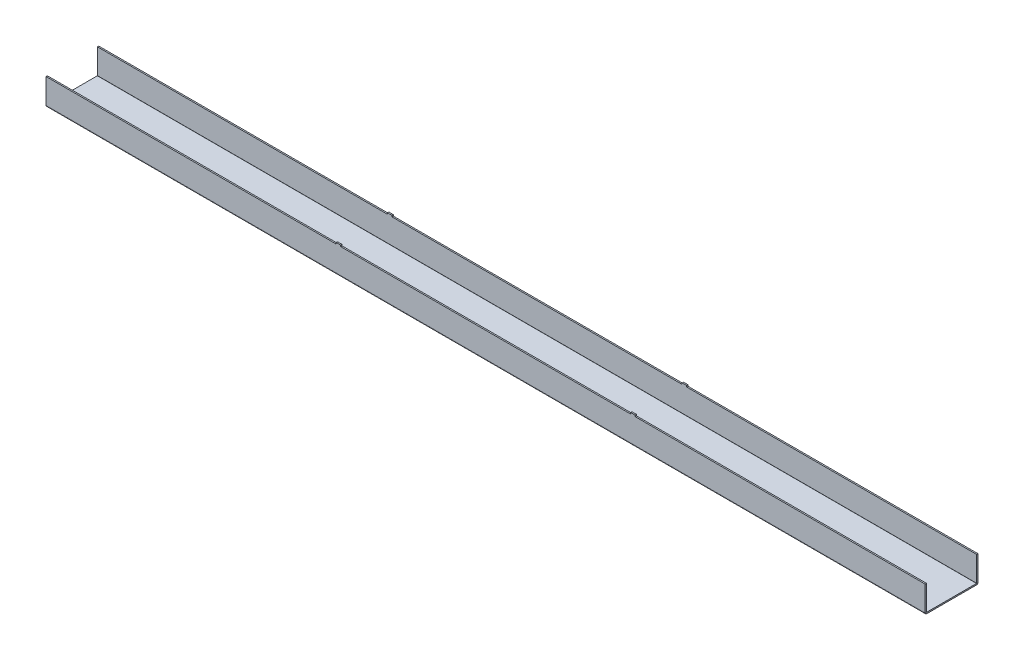
ISO-10303-21;
HEADER;
FILE_DESCRIPTION(('STEP AP214'),'2;1');
FILE_NAME('part.step','',(''),(''),'','','');
FILE_SCHEMA(('AUTOMOTIVE_DESIGN { 1 0 10303 214 1 1 1 1 }'));
ENDSEC;
DATA;
#1=APPLICATION_CONTEXT('core data for automotive mechanical design processes');
#2=APPLICATION_PROTOCOL_DEFINITION('international standard','automotive_design',2000,#1);
#3=PRODUCT_CONTEXT('',#1,'mechanical');
#4=PRODUCT('Part','Part','',(#3));
#5=PRODUCT_RELATED_PRODUCT_CATEGORY('part','',(#4));
#6=PRODUCT_DEFINITION_FORMATION('','',#4);
#7=PRODUCT_DEFINITION_CONTEXT('part definition',#1,'design');
#8=PRODUCT_DEFINITION('design','',#6,#7);
#9=PRODUCT_DEFINITION_SHAPE('','',#8);
#10=(LENGTH_UNIT() NAMED_UNIT(*) SI_UNIT(.MILLI.,.METRE.));
#11=(NAMED_UNIT(*) PLANE_ANGLE_UNIT() SI_UNIT($,.RADIAN.));
#12=(NAMED_UNIT(*) SI_UNIT($,.STERADIAN.) SOLID_ANGLE_UNIT());
#13=UNCERTAINTY_MEASURE_WITH_UNIT(LENGTH_MEASURE(1.E-05),#10,'distance_accuracy_value','');
#14=(GEOMETRIC_REPRESENTATION_CONTEXT(3) GLOBAL_UNCERTAINTY_ASSIGNED_CONTEXT((#13)) GLOBAL_UNIT_ASSIGNED_CONTEXT((#10,
#11,#12)) REPRESENTATION_CONTEXT('',''));
#15=CARTESIAN_POINT('',(0.,0.,0.));
#16=DIRECTION('',(0.,0.,1.));
#17=DIRECTION('',(1.,0.,0.));
#18=AXIS2_PLACEMENT_3D('',#15,#16,#17);
#19=CARTESIAN_POINT('',(-170.,1098.5,-2452.3938102758));
#20=DIRECTION('',(-1.,0.,0.));
#21=DIRECTION('',(0.,1.,0.));
#22=AXIS2_PLACEMENT_3D('',#19,#20,#21);
#23=PLANE('',#22);
#24=DIRECTION('',(0.,-1.,0.));
#25=VECTOR('',#24,1.);
#26=CARTESIAN_POINT('',(-170.,1098.5,-450.));
#27=LINE('',#26,#25);
#28=CARTESIAN_POINT('',(-170.,1100.,-450.));
#29=VERTEX_POINT('',#28);
#30=CARTESIAN_POINT('',(-170.,1098.5,-450.));
#31=VERTEX_POINT('',#30);
#32=EDGE_CURVE('E170',#29,#31,#27,.T.);
#33=ORIENTED_EDGE('',*,*,#32,.F.);
#34=DIRECTION('',(0.,0.,1.));
#35=VECTOR('',#34,1.);
#36=CARTESIAN_POINT('',(-170.,1100.,-2452.3938102758));
#37=LINE('',#36,#35);
#38=CARTESIAN_POINT('',(-170.,1100.,-451.5));
#39=VERTEX_POINT('',#38);
#40=EDGE_CURVE('E854',#39,#29,#37,.T.);
#41=ORIENTED_EDGE('',*,*,#40,.F.);
#42=DIRECTION('',(0.,-1.,0.));
#43=VECTOR('',#42,1.);
#44=CARTESIAN_POINT('',(-170.,1098.5,-451.5));
#45=LINE('',#44,#43);
#46=CARTESIAN_POINT('',(-170.,1098.5,-451.5));
#47=VERTEX_POINT('',#46);
#48=EDGE_CURVE('E503',#39,#47,#45,.T.);
#49=ORIENTED_EDGE('',*,*,#48,.T.);
#50=DIRECTION('',(0.,0.,1.));
#51=VECTOR('',#50,1.);
#52=CARTESIAN_POINT('',(-170.,1098.5,-2452.3938102758));
#53=LINE('',#52,#51);
#54=EDGE_CURVE('E508',#47,#31,#53,.T.);
#55=ORIENTED_EDGE('',*,*,#54,.T.);
#56=EDGE_LOOP('',(#33,#41,#49,#55));
#57=FACE_BOUND('',#56,.T.);
#58=ADVANCED_FACE('F54',(#57),#23,.T.);
#59=CARTESIAN_POINT('',(-165.,1100.,-2452.3938102758));
#60=DIRECTION('',(0.,1.,0.));
#61=DIRECTION('',(0.,0.,1.));
#62=AXIS2_PLACEMENT_3D('',#59,#60,#61);
#63=PLANE('',#62);
#64=DIRECTION('',(-1.,0.,0.));
#65=VECTOR('',#64,1.);
#66=CARTESIAN_POINT('',(-165.,1100.,-450.));
#67=LINE('',#66,#65);
#68=CARTESIAN_POINT('',(-165.,1100.,-450.));
#69=VERTEX_POINT('',#68);
#70=EDGE_CURVE('E160',#69,#29,#67,.T.);
#71=ORIENTED_EDGE('',*,*,#70,.F.);
#72=DIRECTION('',(0.,0.,1.));
#73=VECTOR('',#72,1.);
#74=CARTESIAN_POINT('',(-165.,1100.,-2452.3938102758));
#75=LINE('',#74,#73);
#76=CARTESIAN_POINT('',(-165.,1100.,-451.5));
#77=VERTEX_POINT('',#76);
#78=EDGE_CURVE('E846',#77,#69,#75,.T.);
#79=ORIENTED_EDGE('',*,*,#78,.F.);
#80=DIRECTION('',(-1.,0.,0.));
#81=VECTOR('',#80,1.);
#82=CARTESIAN_POINT('',(-165.,1100.,-451.5));
#83=LINE('',#82,#81);
#84=EDGE_CURVE('E856',#77,#39,#83,.T.);
#85=ORIENTED_EDGE('',*,*,#84,.T.);
#86=ORIENTED_EDGE('',*,*,#40,.T.);
#87=EDGE_LOOP('',(#71,#79,#85,#86));
#88=FACE_BOUND('',#87,.T.);
#89=ADVANCED_FACE('F722',(#88),#63,.T.);
#90=CARTESIAN_POINT('',(-165.,1098.5,-2452.3938102758));
#91=DIRECTION('',(1.,0.,0.));
#92=DIRECTION('',(0.,-1.,0.));
#93=AXIS2_PLACEMENT_3D('',#90,#91,#92);
#94=PLANE('',#93);
#95=DIRECTION('',(0.,1.,0.));
#96=VECTOR('',#95,1.);
#97=CARTESIAN_POINT('',(-165.,1098.5,-450.));
#98=LINE('',#97,#96);
#99=CARTESIAN_POINT('',(-165.,1098.5,-450.));
#100=VERTEX_POINT('',#99);
#101=EDGE_CURVE('E782',#100,#69,#98,.T.);
#102=ORIENTED_EDGE('',*,*,#101,.F.);
#103=DIRECTION('',(0.,0.,1.));
#104=VECTOR('',#103,1.);
#105=CARTESIAN_POINT('',(-165.,1098.5,-2452.3938102758));
#106=LINE('',#105,#104);
#107=CARTESIAN_POINT('',(-165.,1098.5,-451.5));
#108=VERTEX_POINT('',#107);
#109=EDGE_CURVE('E842',#108,#100,#106,.T.);
#110=ORIENTED_EDGE('',*,*,#109,.F.);
#111=DIRECTION('',(0.,1.,0.));
#112=VECTOR('',#111,1.);
#113=CARTESIAN_POINT('',(-165.,1098.5,-451.5));
#114=LINE('',#113,#112);
#115=EDGE_CURVE('E849',#108,#77,#114,.T.);
#116=ORIENTED_EDGE('',*,*,#115,.T.);
#117=ORIENTED_EDGE('',*,*,#78,.T.);
#118=EDGE_LOOP('',(#102,#110,#116,#117));
#119=FACE_BOUND('',#118,.T.);
#120=ADVANCED_FACE('F727',(#119),#94,.T.);
#121=CARTESIAN_POINT('',(500.,1098.5,-2452.3938102758));
#122=DIRECTION('',(0.,-1.,0.));
#123=DIRECTION('',(0.,0.,-1.));
#124=AXIS2_PLACEMENT_3D('',#121,#122,#123);
#125=PLANE('',#124);
#126=ORIENTED_EDGE('',*,*,#109,.T.);
#127=DIRECTION('',(-1.,0.,0.));
#128=VECTOR('',#127,1.);
#129=CARTESIAN_POINT('',(500.,1098.5,-450.));
#130=LINE('',#129,#128);
#131=CARTESIAN_POINT('',(165.,1098.5,-450.));
#132=VERTEX_POINT('',#131);
#133=EDGE_CURVE('E384',#100,#132,#130,.F.);
#134=ORIENTED_EDGE('',*,*,#133,.T.);
#135=DIRECTION('',(0.,0.,1.));
#136=VECTOR('',#135,1.);
#137=CARTESIAN_POINT('',(165.,1098.5,-2452.3938102758));
#138=LINE('',#137,#136);
#139=CARTESIAN_POINT('',(165.,1098.5,-451.5));
#140=VERTEX_POINT('',#139);
#141=EDGE_CURVE('E834',#140,#132,#138,.T.);
#142=ORIENTED_EDGE('',*,*,#141,.F.);
#143=DIRECTION('',(-1.,0.,0.));
#144=VECTOR('',#143,1.);
#145=CARTESIAN_POINT('',(500.,1098.5,-451.5));
#146=LINE('',#145,#144);
#147=EDGE_CURVE('E67',#108,#140,#146,.F.);
#148=ORIENTED_EDGE('',*,*,#147,.F.);
#149=EDGE_LOOP('',(#126,#134,#142,#148));
#150=FACE_BOUND('',#149,.T.);
#151=ADVANCED_FACE('F734',(#150),#125,.F.);
#152=CARTESIAN_POINT('',(165.,1098.5,-2452.3938102758));
#153=DIRECTION('',(-1.,0.,0.));
#154=DIRECTION('',(0.,1.,0.));
#155=AXIS2_PLACEMENT_3D('',#152,#153,#154);
#156=PLANE('',#155);
#157=DIRECTION('',(0.,-1.,0.));
#158=VECTOR('',#157,1.);
#159=CARTESIAN_POINT('',(165.,1098.5,-450.));
#160=LINE('',#159,#158);
#161=CARTESIAN_POINT('',(165.,1100.,-450.));
#162=VERTEX_POINT('',#161);
#163=EDGE_CURVE('E785',#162,#132,#160,.T.);
#164=ORIENTED_EDGE('',*,*,#163,.F.);
#165=DIRECTION('',(0.,0.,1.));
#166=VECTOR('',#165,1.);
#167=CARTESIAN_POINT('',(165.,1100.,-2452.3938102758));
#168=LINE('',#167,#166);
#169=CARTESIAN_POINT('',(165.,1100.,-451.5));
#170=VERTEX_POINT('',#169);
#171=EDGE_CURVE('E800',#170,#162,#168,.T.);
#172=ORIENTED_EDGE('',*,*,#171,.F.);
#173=DIRECTION('',(0.,-1.,0.));
#174=VECTOR('',#173,1.);
#175=CARTESIAN_POINT('',(165.,1098.5,-451.5));
#176=LINE('',#175,#174);
#177=EDGE_CURVE('E837',#170,#140,#176,.T.);
#178=ORIENTED_EDGE('',*,*,#177,.T.);
#179=ORIENTED_EDGE('',*,*,#141,.T.);
#180=EDGE_LOOP('',(#164,#172,#178,#179));
#181=FACE_BOUND('',#180,.T.);
#182=ADVANCED_FACE('F741',(#181),#156,.T.);
#183=CARTESIAN_POINT('',(170.,1100.,-2452.3938102758));
#184=DIRECTION('',(0.,1.,0.));
#185=DIRECTION('',(0.,0.,1.));
#186=AXIS2_PLACEMENT_3D('',#183,#184,#185);
#187=PLANE('',#186);
#188=DIRECTION('',(-1.,0.,0.));
#189=VECTOR('',#188,1.);
#190=CARTESIAN_POINT('',(170.,1100.,-450.));
#191=LINE('',#190,#189);
#192=CARTESIAN_POINT('',(170.,1100.,-450.));
#193=VERTEX_POINT('',#192);
#194=EDGE_CURVE('E400',#193,#162,#191,.T.);
#195=ORIENTED_EDGE('',*,*,#194,.F.);
#196=DIRECTION('',(0.,0.,1.));
#197=VECTOR('',#196,1.);
#198=CARTESIAN_POINT('',(170.,1100.,-2452.3938102758));
#199=LINE('',#198,#197);
#200=CARTESIAN_POINT('',(170.,1100.,-451.5));
#201=VERTEX_POINT('',#200);
#202=EDGE_CURVE('E798',#201,#193,#199,.T.);
#203=ORIENTED_EDGE('',*,*,#202,.F.);
#204=DIRECTION('',(-1.,0.,0.));
#205=VECTOR('',#204,1.);
#206=CARTESIAN_POINT('',(170.,1100.,-451.5));
#207=LINE('',#206,#205);
#208=EDGE_CURVE('E830',#201,#170,#207,.T.);
#209=ORIENTED_EDGE('',*,*,#208,.T.);
#210=ORIENTED_EDGE('',*,*,#171,.T.);
#211=EDGE_LOOP('',(#195,#203,#209,#210));
#212=FACE_BOUND('',#211,.T.);
#213=ADVANCED_FACE('F744',(#212),#187,.T.);
#214=CARTESIAN_POINT('',(170.,1098.5,-2452.3938102758));
#215=DIRECTION('',(1.,0.,0.));
#216=DIRECTION('',(0.,-1.,0.));
#217=AXIS2_PLACEMENT_3D('',#214,#215,#216);
#218=PLANE('',#217);
#219=DIRECTION('',(0.,1.,0.));
#220=VECTOR('',#219,1.);
#221=CARTESIAN_POINT('',(170.,1098.5,-450.));
#222=LINE('',#221,#220);
#223=CARTESIAN_POINT('',(170.,1098.5,-450.));
#224=VERTEX_POINT('',#223);
#225=EDGE_CURVE('E349',#224,#193,#222,.T.);
#226=ORIENTED_EDGE('',*,*,#225,.F.);
#227=DIRECTION('',(0.,0.,1.));
#228=VECTOR('',#227,1.);
#229=CARTESIAN_POINT('',(170.,1098.5,-2452.3938102758));
#230=LINE('',#229,#228);
#231=CARTESIAN_POINT('',(170.,1098.5,-451.5));
#232=VERTEX_POINT('',#231);
#233=EDGE_CURVE('E805',#232,#224,#230,.T.);
#234=ORIENTED_EDGE('',*,*,#233,.F.);
#235=DIRECTION('',(0.,1.,0.));
#236=VECTOR('',#235,1.);
#237=CARTESIAN_POINT('',(170.,1098.5,-451.5));
#238=LINE('',#237,#236);
#239=EDGE_CURVE('E804',#232,#201,#238,.T.);
#240=ORIENTED_EDGE('',*,*,#239,.T.);
#241=ORIENTED_EDGE('',*,*,#202,.T.);
#242=EDGE_LOOP('',(#226,#234,#240,#241));
#243=FACE_BOUND('',#242,.T.);
#244=ADVANCED_FACE('F748',(#243),#218,.T.);
#245=ORIENTED_EDGE('',*,*,#233,.T.);
#246=CARTESIAN_POINT('',(500.,1098.5,-450.));
#247=VERTEX_POINT('',#246);
#248=EDGE_CURVE('E385',#224,#247,#130,.F.);
#249=ORIENTED_EDGE('',*,*,#248,.T.);
#250=DIRECTION('',(0.,0.,1.));
#251=VECTOR('',#250,1.);
#252=CARTESIAN_POINT('',(500.,1098.5,-2452.3938102758));
#253=LINE('',#252,#251);
#254=CARTESIAN_POINT('',(500.,1098.5,-451.5));
#255=VERTEX_POINT('',#254);
#256=EDGE_CURVE('E766',#255,#247,#253,.T.);
#257=ORIENTED_EDGE('',*,*,#256,.F.);
#258=EDGE_CURVE('E12',#232,#255,#146,.F.);
#259=ORIENTED_EDGE('',*,*,#258,.F.);
#260=EDGE_LOOP('',(#245,#249,#257,#259));
#261=FACE_BOUND('',#260,.T.);
#262=ADVANCED_FACE('F739',(#261),#125,.F.);
#263=DIRECTION('',(0.,0.,1.));
#264=VECTOR('',#263,1.);
#265=CARTESIAN_POINT('',(-500.,1098.5,-2452.3938102758));
#266=LINE('',#265,#264);
#267=CARTESIAN_POINT('',(-500.,1098.5,-451.5));
#268=VERTEX_POINT('',#267);
#269=CARTESIAN_POINT('',(-500.,1098.5,-450.));
#270=VERTEX_POINT('',#269);
#271=EDGE_CURVE('E382',#268,#270,#266,.T.);
#272=ORIENTED_EDGE('',*,*,#271,.T.);
#273=EDGE_CURVE('E373',#270,#31,#130,.F.);
#274=ORIENTED_EDGE('',*,*,#273,.T.);
#275=ORIENTED_EDGE('',*,*,#54,.F.);
#276=EDGE_CURVE('E69',#268,#47,#146,.F.);
#277=ORIENTED_EDGE('',*,*,#276,.F.);
#278=EDGE_LOOP('',(#272,#274,#275,#277));
#279=FACE_BOUND('',#278,.T.);
#280=ADVANCED_FACE('F736',(#279),#125,.F.);
#281=CARTESIAN_POINT('',(-500.,1070.7366,-2452.3938102758));
#282=DIRECTION('',(-1.,0.,0.));
#283=DIRECTION('',(0.,1.,0.));
#284=AXIS2_PLACEMENT_3D('',#281,#282,#283);
#285=PLANE('',#284);
#286=DIRECTION('',(0.,1.,0.));
#287=VECTOR('',#286,1.);
#288=CARTESIAN_POINT('',(-500.,1070.7366,-450.));
#289=LINE('',#288,#287);
#290=CARTESIAN_POINT('',(-500.,1070.1,-450.));
#291=VERTEX_POINT('',#290);
#292=EDGE_CURVE('E365',#291,#270,#289,.T.);
#293=ORIENTED_EDGE('',*,*,#292,.T.);
#294=ORIENTED_EDGE('',*,*,#271,.F.);
#295=DIRECTION('',(0.,1.,0.));
#296=VECTOR('',#295,1.);
#297=CARTESIAN_POINT('',(-500.,1070.7366,-451.5));
#298=LINE('',#297,#296);
#299=CARTESIAN_POINT('',(-500.,1070.1,-451.5));
#300=VERTEX_POINT('',#299);
#301=EDGE_CURVE('E367',#268,#300,#298,.F.);
#302=ORIENTED_EDGE('',*,*,#301,.T.);
#303=DIRECTION('',(0.,0.,1.));
#304=VECTOR('',#303,1.);
#305=CARTESIAN_POINT('',(-500.,1070.1,-2452.3938102758));
#306=LINE('',#305,#304);
#307=EDGE_CURVE('E350',#300,#291,#306,.T.);
#308=ORIENTED_EDGE('',*,*,#307,.T.);
#309=EDGE_LOOP('',(#293,#294,#302,#308));
#310=FACE_BOUND('',#309,.T.);
#311=ADVANCED_FACE('F363',(#310),#285,.T.);
#312=CARTESIAN_POINT('',(500.,1068.5,-450.));
#313=DIRECTION('',(0.,0.,-1.));
#314=DIRECTION('',(-1.,0.,0.));
#315=AXIS2_PLACEMENT_3D('',#312,#313,#314);
#316=PLANE('',#315);
#317=ORIENTED_EDGE('',*,*,#292,.F.);
#318=DIRECTION('',(1.,0.,0.));
#319=VECTOR('',#318,1.);
#320=CARTESIAN_POINT('',(-500.,1070.1,-450.));
#321=LINE('',#320,#319);
#322=CARTESIAN_POINT('',(500.,1070.1,-450.));
#323=VERTEX_POINT('',#322);
#324=EDGE_CURVE('E338',#291,#323,#321,.T.);
#325=ORIENTED_EDGE('',*,*,#324,.T.);
#326=DIRECTION('',(0.,1.,0.));
#327=VECTOR('',#326,1.);
#328=CARTESIAN_POINT('',(500.,1070.7366,-450.));
#329=LINE('',#328,#327);
#330=EDGE_CURVE('E764',#247,#323,#329,.F.);
#331=ORIENTED_EDGE('',*,*,#330,.F.);
#332=ORIENTED_EDGE('',*,*,#248,.F.);
#333=ORIENTED_EDGE('',*,*,#225,.T.);
#334=ORIENTED_EDGE('',*,*,#194,.T.);
#335=ORIENTED_EDGE('',*,*,#163,.T.);
#336=ORIENTED_EDGE('',*,*,#133,.F.);
#337=ORIENTED_EDGE('',*,*,#101,.T.);
#338=ORIENTED_EDGE('',*,*,#70,.T.);
#339=ORIENTED_EDGE('',*,*,#32,.T.);
#340=ORIENTED_EDGE('',*,*,#273,.F.);
#341=EDGE_LOOP('',(#317,#325,#331,#332,#333,#334,#335,#336,#337,#338,#339,#340));
#342=FACE_BOUND('',#341,.T.);
#343=ADVANCED_FACE('F372',(#342),#316,.F.);
#344=CARTESIAN_POINT('',(500.,1070.7366,-2452.3938102758));
#345=DIRECTION('',(1.,0.,0.));
#346=DIRECTION('',(0.,-1.,0.));
#347=AXIS2_PLACEMENT_3D('',#344,#345,#346);
#348=PLANE('',#347);
#349=ORIENTED_EDGE('',*,*,#330,.T.);
#350=DIRECTION('',(0.,0.,1.));
#351=VECTOR('',#350,1.);
#352=CARTESIAN_POINT('',(500.,1070.1,-2452.3938102758));
#353=LINE('',#352,#351);
#354=CARTESIAN_POINT('',(500.,1070.1,-451.5));
#355=VERTEX_POINT('',#354);
#356=EDGE_CURVE('E509',#355,#323,#353,.T.);
#357=ORIENTED_EDGE('',*,*,#356,.F.);
#358=DIRECTION('',(0.,1.,0.));
#359=VECTOR('',#358,1.);
#360=CARTESIAN_POINT('',(500.,1070.7366,-451.5));
#361=LINE('',#360,#359);
#362=EDGE_CURVE('E770',#355,#255,#361,.T.);
#363=ORIENTED_EDGE('',*,*,#362,.T.);
#364=ORIENTED_EDGE('',*,*,#256,.T.);
#365=EDGE_LOOP('',(#349,#357,#363,#364));
#366=FACE_BOUND('',#365,.T.);
#367=ADVANCED_FACE('F757',(#366),#348,.T.);
#368=CARTESIAN_POINT('',(500.,1068.5,-451.5));
#369=DIRECTION('',(0.,0.,-1.));
#370=DIRECTION('',(-1.,0.,0.));
#371=AXIS2_PLACEMENT_3D('',#368,#369,#370);
#372=PLANE('',#371);
#373=DIRECTION('',(1.,0.,0.));
#374=VECTOR('',#373,1.);
#375=CARTESIAN_POINT('',(-500.,1070.1,-451.5));
#376=LINE('',#375,#374);
#377=EDGE_CURVE('E59',#300,#355,#376,.T.);
#378=ORIENTED_EDGE('',*,*,#377,.F.);
#379=ORIENTED_EDGE('',*,*,#301,.F.);
#380=ORIENTED_EDGE('',*,*,#276,.T.);
#381=ORIENTED_EDGE('',*,*,#48,.F.);
#382=ORIENTED_EDGE('',*,*,#84,.F.);
#383=ORIENTED_EDGE('',*,*,#115,.F.);
#384=ORIENTED_EDGE('',*,*,#147,.T.);
#385=ORIENTED_EDGE('',*,*,#177,.F.);
#386=ORIENTED_EDGE('',*,*,#208,.F.);
#387=ORIENTED_EDGE('',*,*,#239,.F.);
#388=ORIENTED_EDGE('',*,*,#258,.T.);
#389=ORIENTED_EDGE('',*,*,#362,.F.);
#390=EDGE_LOOP('',(#378,#379,#380,#381,#382,#383,#384,#385,#386,#387,#388,#389));
#391=FACE_BOUND('',#390,.T.);
#392=ADVANCED_FACE('F57',(#391),#372,.T.);
#393=CARTESIAN_POINT('',(170.,1098.5,1492.3938102758));
#394=DIRECTION('',(1.,0.,0.));
#395=DIRECTION('',(0.,0.,1.));
#396=AXIS2_PLACEMENT_3D('',#393,#394,#395);
#397=PLANE('',#396);
#398=DIRECTION('',(0.,-1.,0.));
#399=VECTOR('',#398,1.);
#400=CARTESIAN_POINT('',(170.,1098.5,-510.));
#401=LINE('',#400,#399);
#402=CARTESIAN_POINT('',(170.,1100.,-510.));
#403=VERTEX_POINT('',#402);
#404=CARTESIAN_POINT('',(170.,1098.5,-510.));
#405=VERTEX_POINT('',#404);
#406=EDGE_CURVE('E271',#403,#405,#401,.T.);
#407=ORIENTED_EDGE('',*,*,#406,.F.);
#408=DIRECTION('',(0.,0.,-1.));
#409=VECTOR('',#408,1.);
#410=CARTESIAN_POINT('',(170.,1100.,1492.3938102758));
#411=LINE('',#410,#409);
#412=CARTESIAN_POINT('',(170.,1100.,-508.5));
#413=VERTEX_POINT('',#412);
#414=EDGE_CURVE('E575',#413,#403,#411,.T.);
#415=ORIENTED_EDGE('',*,*,#414,.F.);
#416=DIRECTION('',(0.,-1.,0.));
#417=VECTOR('',#416,1.);
#418=CARTESIAN_POINT('',(170.,1098.5,-508.5));
#419=LINE('',#418,#417);
#420=CARTESIAN_POINT('',(170.,1098.5,-508.5));
#421=VERTEX_POINT('',#420);
#422=EDGE_CURVE('E570',#413,#421,#419,.T.);
#423=ORIENTED_EDGE('',*,*,#422,.T.);
#424=DIRECTION('',(0.,0.,-1.));
#425=VECTOR('',#424,1.);
#426=CARTESIAN_POINT('',(170.,1098.5,1492.3938102758));
#427=LINE('',#426,#425);
#428=EDGE_CURVE('E567',#421,#405,#427,.T.);
#429=ORIENTED_EDGE('',*,*,#428,.T.);
#430=EDGE_LOOP('',(#407,#415,#423,#429));
#431=FACE_BOUND('',#430,.T.);
#432=ADVANCED_FACE('F763',(#431),#397,.T.);
#433=CARTESIAN_POINT('',(165.,1100.,1492.3938102758));
#434=DIRECTION('',(0.,1.,0.));
#435=DIRECTION('',(-1.,0.,0.));
#436=AXIS2_PLACEMENT_3D('',#433,#434,#435);
#437=PLANE('',#436);
#438=DIRECTION('',(1.,0.,0.));
#439=VECTOR('',#438,1.);
#440=CARTESIAN_POINT('',(165.,1100.,-510.));
#441=LINE('',#440,#439);
#442=CARTESIAN_POINT('',(165.,1100.,-510.));
#443=VERTEX_POINT('',#442);
#444=EDGE_CURVE('E263',#443,#403,#441,.T.);
#445=ORIENTED_EDGE('',*,*,#444,.F.);
#446=DIRECTION('',(0.,0.,-1.));
#447=VECTOR('',#446,1.);
#448=CARTESIAN_POINT('',(165.,1100.,1492.3938102758));
#449=LINE('',#448,#447);
#450=CARTESIAN_POINT('',(165.,1100.,-508.5));
#451=VERTEX_POINT('',#450);
#452=EDGE_CURVE('E597',#451,#443,#449,.T.);
#453=ORIENTED_EDGE('',*,*,#452,.F.);
#454=DIRECTION('',(1.,0.,0.));
#455=VECTOR('',#454,1.);
#456=CARTESIAN_POINT('',(165.,1100.,-508.5));
#457=LINE('',#456,#455);
#458=EDGE_CURVE('E569',#451,#413,#457,.T.);
#459=ORIENTED_EDGE('',*,*,#458,.T.);
#460=ORIENTED_EDGE('',*,*,#414,.T.);
#461=EDGE_LOOP('',(#445,#453,#459,#460));
#462=FACE_BOUND('',#461,.T.);
#463=ADVANCED_FACE('F602',(#462),#437,.T.);
#464=CARTESIAN_POINT('',(165.,1098.5,1492.3938102758));
#465=DIRECTION('',(-1.,0.,0.));
#466=DIRECTION('',(0.,0.,-1.));
#467=AXIS2_PLACEMENT_3D('',#464,#465,#466);
#468=PLANE('',#467);
#469=DIRECTION('',(0.,1.,0.));
#470=VECTOR('',#469,1.);
#471=CARTESIAN_POINT('',(165.,1098.5,-510.));
#472=LINE('',#471,#470);
#473=CARTESIAN_POINT('',(165.,1098.5,-510.));
#474=VERTEX_POINT('',#473);
#475=EDGE_CURVE('E475',#474,#443,#472,.T.);
#476=ORIENTED_EDGE('',*,*,#475,.F.);
#477=DIRECTION('',(0.,0.,-1.));
#478=VECTOR('',#477,1.);
#479=CARTESIAN_POINT('',(165.,1098.5,1492.3938102758));
#480=LINE('',#479,#478);
#481=CARTESIAN_POINT('',(165.,1098.5,-508.5));
#482=VERTEX_POINT('',#481);
#483=EDGE_CURVE('E608',#482,#474,#480,.T.);
#484=ORIENTED_EDGE('',*,*,#483,.F.);
#485=DIRECTION('',(0.,1.,0.));
#486=VECTOR('',#485,1.);
#487=CARTESIAN_POINT('',(165.,1098.5,-508.5));
#488=LINE('',#487,#486);
#489=EDGE_CURVE('E592',#482,#451,#488,.T.);
#490=ORIENTED_EDGE('',*,*,#489,.T.);
#491=ORIENTED_EDGE('',*,*,#452,.T.);
#492=EDGE_LOOP('',(#476,#484,#490,#491));
#493=FACE_BOUND('',#492,.T.);
#494=ADVANCED_FACE('F607',(#493),#468,.T.);
#495=CARTESIAN_POINT('',(500.,1098.5,1492.3938102758));
#496=DIRECTION('',(0.,-1.,0.));
#497=DIRECTION('',(1.,0.,0.));
#498=AXIS2_PLACEMENT_3D('',#495,#496,#497);
#499=PLANE('',#498);
#500=ORIENTED_EDGE('',*,*,#483,.T.);
#501=DIRECTION('',(1.,0.,0.));
#502=VECTOR('',#501,1.);
#503=CARTESIAN_POINT('',(500.,1098.5,-510.));
#504=LINE('',#503,#502);
#505=CARTESIAN_POINT('',(-165.,1098.5,-510.));
#506=VERTEX_POINT('',#505);
#507=EDGE_CURVE('E543',#474,#506,#504,.F.);
#508=ORIENTED_EDGE('',*,*,#507,.T.);
#509=DIRECTION('',(0.,0.,-1.));
#510=VECTOR('',#509,1.);
#511=CARTESIAN_POINT('',(-165.,1098.5,1492.3938102758));
#512=LINE('',#511,#510);
#513=CARTESIAN_POINT('',(-165.,1098.5,-508.5));
#514=VERTEX_POINT('',#513);
#515=EDGE_CURVE('E622',#514,#506,#512,.T.);
#516=ORIENTED_EDGE('',*,*,#515,.F.);
#517=DIRECTION('',(1.,0.,0.));
#518=VECTOR('',#517,1.);
#519=CARTESIAN_POINT('',(500.,1098.5,-508.5));
#520=LINE('',#519,#518);
#521=EDGE_CURVE('E519',#482,#514,#520,.F.);
#522=ORIENTED_EDGE('',*,*,#521,.F.);
#523=EDGE_LOOP('',(#500,#508,#516,#522));
#524=FACE_BOUND('',#523,.T.);
#525=ADVANCED_FACE('F611',(#524),#499,.F.);
#526=CARTESIAN_POINT('',(-165.,1098.5,1492.3938102758));
#527=DIRECTION('',(1.,0.,0.));
#528=DIRECTION('',(0.,0.,1.));
#529=AXIS2_PLACEMENT_3D('',#526,#527,#528);
#530=PLANE('',#529);
#531=DIRECTION('',(0.,-1.,0.));
#532=VECTOR('',#531,1.);
#533=CARTESIAN_POINT('',(-165.,1098.5,-510.));
#534=LINE('',#533,#532);
#535=CARTESIAN_POINT('',(-165.,1100.,-510.));
#536=VERTEX_POINT('',#535);
#537=EDGE_CURVE('E470',#536,#506,#534,.T.);
#538=ORIENTED_EDGE('',*,*,#537,.F.);
#539=DIRECTION('',(0.,0.,-1.));
#540=VECTOR('',#539,1.);
#541=CARTESIAN_POINT('',(-165.,1100.,1492.3938102758));
#542=LINE('',#541,#540);
#543=CARTESIAN_POINT('',(-165.,1100.,-508.5));
#544=VERTEX_POINT('',#543);
#545=EDGE_CURVE('E630',#544,#536,#542,.T.);
#546=ORIENTED_EDGE('',*,*,#545,.F.);
#547=DIRECTION('',(0.,-1.,0.));
#548=VECTOR('',#547,1.);
#549=CARTESIAN_POINT('',(-165.,1098.5,-508.5));
#550=LINE('',#549,#548);
#551=EDGE_CURVE('E617',#544,#514,#550,.T.);
#552=ORIENTED_EDGE('',*,*,#551,.T.);
#553=ORIENTED_EDGE('',*,*,#515,.T.);
#554=EDGE_LOOP('',(#538,#546,#552,#553));
#555=FACE_BOUND('',#554,.T.);
#556=ADVANCED_FACE('F964',(#555),#530,.T.);
#557=CARTESIAN_POINT('',(-170.,1100.,1492.3938102758));
#558=DIRECTION('',(0.,1.,0.));
#559=DIRECTION('',(-1.,0.,0.));
#560=AXIS2_PLACEMENT_3D('',#557,#558,#559);
#561=PLANE('',#560);
#562=DIRECTION('',(1.,0.,0.));
#563=VECTOR('',#562,1.);
#564=CARTESIAN_POINT('',(-170.,1100.,-510.));
#565=LINE('',#564,#563);
#566=CARTESIAN_POINT('',(-170.,1100.,-510.));
#567=VERTEX_POINT('',#566);
#568=EDGE_CURVE('E466',#567,#536,#565,.T.);
#569=ORIENTED_EDGE('',*,*,#568,.F.);
#570=DIRECTION('',(0.,0.,-1.));
#571=VECTOR('',#570,1.);
#572=CARTESIAN_POINT('',(-170.,1100.,1492.3938102758));
#573=LINE('',#572,#571);
#574=CARTESIAN_POINT('',(-170.,1100.,-508.5));
#575=VERTEX_POINT('',#574);
#576=EDGE_CURVE('E638',#575,#567,#573,.T.);
#577=ORIENTED_EDGE('',*,*,#576,.F.);
#578=DIRECTION('',(1.,0.,0.));
#579=VECTOR('',#578,1.);
#580=CARTESIAN_POINT('',(-170.,1100.,-508.5));
#581=LINE('',#580,#579);
#582=EDGE_CURVE('E625',#575,#544,#581,.T.);
#583=ORIENTED_EDGE('',*,*,#582,.T.);
#584=ORIENTED_EDGE('',*,*,#545,.T.);
#585=EDGE_LOOP('',(#569,#577,#583,#584));
#586=FACE_BOUND('',#585,.T.);
#587=ADVANCED_FACE('F973',(#586),#561,.T.);
#588=CARTESIAN_POINT('',(-170.,1098.5,1492.3938102758));
#589=DIRECTION('',(-1.,0.,0.));
#590=DIRECTION('',(0.,0.,-1.));
#591=AXIS2_PLACEMENT_3D('',#588,#589,#590);
#592=PLANE('',#591);
#593=DIRECTION('',(0.,1.,0.));
#594=VECTOR('',#593,1.);
#595=CARTESIAN_POINT('',(-170.,1098.5,-510.));
#596=LINE('',#595,#594);
#597=CARTESIAN_POINT('',(-170.,1098.5,-510.));
#598=VERTEX_POINT('',#597);
#599=EDGE_CURVE('E440',#598,#567,#596,.T.);
#600=ORIENTED_EDGE('',*,*,#599,.F.);
#601=DIRECTION('',(0.,0.,-1.));
#602=VECTOR('',#601,1.);
#603=CARTESIAN_POINT('',(-170.,1098.5,1492.3938102758));
#604=LINE('',#603,#602);
#605=CARTESIAN_POINT('',(-170.,1098.5,-508.5));
#606=VERTEX_POINT('',#605);
#607=EDGE_CURVE('E538',#606,#598,#604,.T.);
#608=ORIENTED_EDGE('',*,*,#607,.F.);
#609=DIRECTION('',(0.,1.,0.));
#610=VECTOR('',#609,1.);
#611=CARTESIAN_POINT('',(-170.,1098.5,-508.5));
#612=LINE('',#611,#610);
#613=EDGE_CURVE('E633',#606,#575,#612,.T.);
#614=ORIENTED_EDGE('',*,*,#613,.T.);
#615=ORIENTED_EDGE('',*,*,#576,.T.);
#616=EDGE_LOOP('',(#600,#608,#614,#615));
#617=FACE_BOUND('',#616,.T.);
#618=ADVANCED_FACE('F983',(#617),#592,.T.);
#619=ORIENTED_EDGE('',*,*,#607,.T.);
#620=CARTESIAN_POINT('',(-500.,1098.5,-510.));
#621=VERTEX_POINT('',#620);
#622=EDGE_CURVE('E455',#598,#621,#504,.F.);
#623=ORIENTED_EDGE('',*,*,#622,.T.);
#624=DIRECTION('',(0.,0.,-1.));
#625=VECTOR('',#624,1.);
#626=CARTESIAN_POINT('',(-500.,1098.5,1492.3938102758));
#627=LINE('',#626,#625);
#628=CARTESIAN_POINT('',(-500.,1098.5,-508.500000000001));
#629=VERTEX_POINT('',#628);
#630=EDGE_CURVE('E492',#629,#621,#627,.T.);
#631=ORIENTED_EDGE('',*,*,#630,.F.);
#632=EDGE_CURVE('E181',#606,#629,#520,.F.);
#633=ORIENTED_EDGE('',*,*,#632,.F.);
#634=EDGE_LOOP('',(#619,#623,#631,#633));
#635=FACE_BOUND('',#634,.T.);
#636=ADVANCED_FACE('F536',(#635),#499,.F.);
#637=DIRECTION('',(0.,0.,-1.));
#638=VECTOR('',#637,1.);
#639=CARTESIAN_POINT('',(500.,1098.5,1492.3938102758));
#640=LINE('',#639,#638);
#641=CARTESIAN_POINT('',(500.,1098.5,-508.5));
#642=VERTEX_POINT('',#641);
#643=CARTESIAN_POINT('',(500.,1098.5,-510.));
#644=VERTEX_POINT('',#643);
#645=EDGE_CURVE('E542',#642,#644,#640,.T.);
#646=ORIENTED_EDGE('',*,*,#645,.T.);
#647=EDGE_CURVE('E454',#644,#405,#504,.F.);
#648=ORIENTED_EDGE('',*,*,#647,.T.);
#649=ORIENTED_EDGE('',*,*,#428,.F.);
#650=EDGE_CURVE('E520',#642,#421,#520,.F.);
#651=ORIENTED_EDGE('',*,*,#650,.F.);
#652=EDGE_LOOP('',(#646,#648,#649,#651));
#653=FACE_BOUND('',#652,.T.);
#654=ADVANCED_FACE('F566',(#653),#499,.F.);
#655=CARTESIAN_POINT('',(500.,1070.7366,1492.3938102758));
#656=DIRECTION('',(1.,0.,0.));
#657=DIRECTION('',(0.,0.,1.));
#658=AXIS2_PLACEMENT_3D('',#655,#656,#657);
#659=PLANE('',#658);
#660=DIRECTION('',(0.,1.,0.));
#661=VECTOR('',#660,1.);
#662=CARTESIAN_POINT('',(500.,1070.7366,-510.));
#663=LINE('',#662,#661);
#664=CARTESIAN_POINT('',(500.000000000001,1070.1,-510.));
#665=VERTEX_POINT('',#664);
#666=EDGE_CURVE('E450',#665,#644,#663,.T.);
#667=ORIENTED_EDGE('',*,*,#666,.T.);
#668=ORIENTED_EDGE('',*,*,#645,.F.);
#669=DIRECTION('',(0.,1.,0.));
#670=VECTOR('',#669,1.);
#671=CARTESIAN_POINT('',(500.,1070.7366,-508.5));
#672=LINE('',#671,#670);
#673=CARTESIAN_POINT('',(500.000000000001,1070.1,-508.5));
#674=VERTEX_POINT('',#673);
#675=EDGE_CURVE('E447',#642,#674,#672,.F.);
#676=ORIENTED_EDGE('',*,*,#675,.T.);
#677=DIRECTION('',(0.,0.,-1.));
#678=VECTOR('',#677,1.);
#679=CARTESIAN_POINT('',(500.,1070.1,1492.3938102758));
#680=LINE('',#679,#678);
#681=EDGE_CURVE('E441',#674,#665,#680,.T.);
#682=ORIENTED_EDGE('',*,*,#681,.T.);
#683=EDGE_LOOP('',(#667,#668,#676,#682));
#684=FACE_BOUND('',#683,.T.);
#685=ADVANCED_FACE('F558',(#684),#659,.T.);
#686=CARTESIAN_POINT('',(500.,1098.5,-510.));
#687=DIRECTION('',(0.,0.,1.));
#688=DIRECTION('',(1.,0.,0.));
#689=AXIS2_PLACEMENT_3D('',#686,#687,#688);
#690=PLANE('',#689);
#691=ORIENTED_EDGE('',*,*,#666,.F.);
#692=DIRECTION('',(-1.,0.,0.));
#693=VECTOR('',#692,1.);
#694=CARTESIAN_POINT('',(500.,1070.1,-510.));
#695=LINE('',#694,#693);
#696=CARTESIAN_POINT('',(-499.999999999999,1070.1,-510.));
#697=VERTEX_POINT('',#696);
#698=EDGE_CURVE('E434',#665,#697,#695,.T.);
#699=ORIENTED_EDGE('',*,*,#698,.T.);
#700=DIRECTION('',(0.,1.,0.));
#701=VECTOR('',#700,1.);
#702=CARTESIAN_POINT('',(-500.,1070.7366,-510.));
#703=LINE('',#702,#701);
#704=EDGE_CURVE('E485',#621,#697,#703,.F.);
#705=ORIENTED_EDGE('',*,*,#704,.F.);
#706=ORIENTED_EDGE('',*,*,#622,.F.);
#707=ORIENTED_EDGE('',*,*,#599,.T.);
#708=ORIENTED_EDGE('',*,*,#568,.T.);
#709=ORIENTED_EDGE('',*,*,#537,.T.);
#710=ORIENTED_EDGE('',*,*,#507,.F.);
#711=ORIENTED_EDGE('',*,*,#475,.T.);
#712=ORIENTED_EDGE('',*,*,#444,.T.);
#713=ORIENTED_EDGE('',*,*,#406,.T.);
#714=ORIENTED_EDGE('',*,*,#647,.F.);
#715=EDGE_LOOP('',(#691,#699,#705,#706,#707,#708,#709,#710,#711,#712,#713,#714));
#716=FACE_BOUND('',#715,.T.);
#717=ADVANCED_FACE('F546',(#716),#690,.F.);
#718=CARTESIAN_POINT('',(-500.,1070.7366,1492.3938102758));
#719=DIRECTION('',(-1.,0.,0.));
#720=DIRECTION('',(0.,0.,-1.));
#721=AXIS2_PLACEMENT_3D('',#718,#719,#720);
#722=PLANE('',#721);
#723=ORIENTED_EDGE('',*,*,#704,.T.);
#724=DIRECTION('',(0.,0.,-1.));
#725=VECTOR('',#724,1.);
#726=CARTESIAN_POINT('',(-499.999999999999,1070.1,1492.3938102758));
#727=LINE('',#726,#725);
#728=CARTESIAN_POINT('',(-499.999999999998,1070.1,-508.5));
#729=VERTEX_POINT('',#728);
#730=EDGE_CURVE('E577',#729,#697,#727,.T.);
#731=ORIENTED_EDGE('',*,*,#730,.F.);
#732=DIRECTION('',(0.,1.,0.));
#733=VECTOR('',#732,1.);
#734=CARTESIAN_POINT('',(-500.,1070.7366,-508.5));
#735=LINE('',#734,#733);
#736=EDGE_CURVE('E488',#729,#629,#735,.T.);
#737=ORIENTED_EDGE('',*,*,#736,.T.);
#738=ORIENTED_EDGE('',*,*,#630,.T.);
#739=EDGE_LOOP('',(#723,#731,#737,#738));
#740=FACE_BOUND('',#739,.T.);
#741=ADVANCED_FACE('F530',(#740),#722,.T.);
#742=CARTESIAN_POINT('',(500.,1098.5,-508.5));
#743=DIRECTION('',(0.,0.,1.));
#744=DIRECTION('',(1.,0.,0.));
#745=AXIS2_PLACEMENT_3D('',#742,#743,#744);
#746=PLANE('',#745);
#747=DIRECTION('',(-1.,0.,0.));
#748=VECTOR('',#747,1.);
#749=CARTESIAN_POINT('',(500.,1070.1,-508.5));
#750=LINE('',#749,#748);
#751=EDGE_CURVE('E563',#674,#729,#750,.T.);
#752=ORIENTED_EDGE('',*,*,#751,.F.);
#753=ORIENTED_EDGE('',*,*,#675,.F.);
#754=ORIENTED_EDGE('',*,*,#650,.T.);
#755=ORIENTED_EDGE('',*,*,#422,.F.);
#756=ORIENTED_EDGE('',*,*,#458,.F.);
#757=ORIENTED_EDGE('',*,*,#489,.F.);
#758=ORIENTED_EDGE('',*,*,#521,.T.);
#759=ORIENTED_EDGE('',*,*,#551,.F.);
#760=ORIENTED_EDGE('',*,*,#582,.F.);
#761=ORIENTED_EDGE('',*,*,#613,.F.);
#762=ORIENTED_EDGE('',*,*,#632,.T.);
#763=ORIENTED_EDGE('',*,*,#736,.F.);
#764=EDGE_LOOP('',(#752,#753,#754,#755,#756,#757,#758,#759,#760,#761,#762,#763));
#765=FACE_BOUND('',#764,.T.);
#766=ADVANCED_FACE('F562',(#765),#746,.T.);
#767=CARTESIAN_POINT('',(500.,1068.5,-510.));
#768=DIRECTION('',(0.,1.,0.));
#769=DIRECTION('',(0.,0.,1.));
#770=AXIS2_PLACEMENT_3D('',#767,#768,#769);
#771=PLANE('',#770);
#772=DIRECTION('',(-1.,0.,0.));
#773=VECTOR('',#772,1.);
#774=CARTESIAN_POINT('',(500.,1068.5,-508.4));
#775=LINE('',#774,#773);
#776=CARTESIAN_POINT('',(500.000000000001,1068.5,-508.4));
#777=VERTEX_POINT('',#776);
#778=CARTESIAN_POINT('',(-500.,1068.5,-508.4));
#779=VERTEX_POINT('',#778);
#780=EDGE_CURVE('E281',#777,#779,#775,.T.);
#781=ORIENTED_EDGE('',*,*,#780,.F.);
#782=DIRECTION('',(0.,0.,-1.));
#783=VECTOR('',#782,1.);
#784=CARTESIAN_POINT('',(500.,1068.5,-451.5));
#785=LINE('',#784,#783);
#786=CARTESIAN_POINT('',(500.,1068.5,-451.6));
#787=VERTEX_POINT('',#786);
#788=EDGE_CURVE('E428',#787,#777,#785,.T.);
#789=ORIENTED_EDGE('',*,*,#788,.F.);
#790=DIRECTION('',(1.,0.,0.));
#791=VECTOR('',#790,1.);
#792=CARTESIAN_POINT('',(-500.,1068.5,-451.6));
#793=LINE('',#792,#791);
#794=CARTESIAN_POINT('',(-500.,1068.5,-451.6));
#795=VERTEX_POINT('',#794);
#796=EDGE_CURVE('E290',#795,#787,#793,.T.);
#797=ORIENTED_EDGE('',*,*,#796,.F.);
#798=DIRECTION('',(0.,0.,1.));
#799=VECTOR('',#798,1.);
#800=CARTESIAN_POINT('',(-500.,1068.5,-508.5));
#801=LINE('',#800,#799);
#802=EDGE_CURVE('E660',#779,#795,#801,.T.);
#803=ORIENTED_EDGE('',*,*,#802,.F.);
#804=EDGE_LOOP('',(#781,#789,#797,#803));
#805=FACE_BOUND('',#804,.T.);
#806=ADVANCED_FACE('F709',(#805),#771,.F.);
#807=CARTESIAN_POINT('',(500.,3073.22364203301,-510.));
#808=DIRECTION('',(-1.,0.,0.));
#809=DIRECTION('',(0.,0.,1.));
#810=AXIS2_PLACEMENT_3D('',#807,#808,#809);
#811=PLANE('',#810);
#812=DIRECTION('',(0.,-1.,0.));
#813=VECTOR('',#812,1.);
#814=CARTESIAN_POINT('',(500.,3073.22364203301,-451.6));
#815=LINE('',#814,#813);
#816=CARTESIAN_POINT('',(500.,1070.,-451.6));
#817=VERTEX_POINT('',#816);
#818=EDGE_CURVE('E679',#817,#787,#815,.T.);
#819=ORIENTED_EDGE('',*,*,#818,.T.);
#820=ORIENTED_EDGE('',*,*,#788,.T.);
#821=DIRECTION('',(0.,-1.,0.));
#822=VECTOR('',#821,1.);
#823=CARTESIAN_POINT('',(500.,3073.22364203301,-508.4));
#824=LINE('',#823,#822);
#825=CARTESIAN_POINT('',(500.000000000001,1070.,-508.4));
#826=VERTEX_POINT('',#825);
#827=EDGE_CURVE('E555',#826,#777,#824,.T.);
#828=ORIENTED_EDGE('',*,*,#827,.F.);
#829=DIRECTION('',(0.,0.,1.));
#830=VECTOR('',#829,1.);
#831=CARTESIAN_POINT('',(500.,1070.,-510.));
#832=LINE('',#831,#830);
#833=EDGE_CURVE('E663',#817,#826,#832,.F.);
#834=ORIENTED_EDGE('',*,*,#833,.F.);
#835=EDGE_LOOP('',(#819,#820,#828,#834));
#836=FACE_BOUND('',#835,.T.);
#837=ADVANCED_FACE('F706',(#836),#811,.F.);
#838=CARTESIAN_POINT('',(-500.,3073.22364203301,-510.));
#839=DIRECTION('',(1.,0.,0.));
#840=DIRECTION('',(0.,0.,-1.));
#841=AXIS2_PLACEMENT_3D('',#838,#839,#840);
#842=PLANE('',#841);
#843=DIRECTION('',(0.,-1.,0.));
#844=VECTOR('',#843,1.);
#845=CARTESIAN_POINT('',(-500.,3073.22364203301,-508.4));
#846=LINE('',#845,#844);
#847=CARTESIAN_POINT('',(-499.999999999999,1070.,-508.4));
#848=VERTEX_POINT('',#847);
#849=EDGE_CURVE('E684',#848,#779,#846,.T.);
#850=ORIENTED_EDGE('',*,*,#849,.T.);
#851=ORIENTED_EDGE('',*,*,#802,.T.);
#852=DIRECTION('',(0.,-1.,0.));
#853=VECTOR('',#852,1.);
#854=CARTESIAN_POINT('',(-500.,3073.22364203301,-451.6));
#855=LINE('',#854,#853);
#856=CARTESIAN_POINT('',(-500.,1070.,-451.6));
#857=VERTEX_POINT('',#856);
#858=EDGE_CURVE('E357',#857,#795,#855,.T.);
#859=ORIENTED_EDGE('',*,*,#858,.F.);
#860=DIRECTION('',(0.,0.,1.));
#861=VECTOR('',#860,1.);
#862=CARTESIAN_POINT('',(-500.,1070.,-510.));
#863=LINE('',#862,#861);
#864=EDGE_CURVE('E672',#848,#857,#863,.T.);
#865=ORIENTED_EDGE('',*,*,#864,.F.);
#866=EDGE_LOOP('',(#850,#851,#859,#865));
#867=FACE_BOUND('',#866,.T.);
#868=ADVANCED_FACE('F700',(#867),#842,.F.);
#869=CARTESIAN_POINT('',(500.,1070.,-510.));
#870=DIRECTION('',(0.,1.,0.));
#871=DIRECTION('',(0.,0.,1.));
#872=AXIS2_PLACEMENT_3D('',#869,#870,#871);
#873=PLANE('',#872);
#874=ORIENTED_EDGE('',*,*,#833,.T.);
#875=DIRECTION('',(-1.,0.,0.));
#876=VECTOR('',#875,1.);
#877=CARTESIAN_POINT('',(500.,1070.,-508.4));
#878=LINE('',#877,#876);
#879=EDGE_CURVE('E668',#826,#848,#878,.T.);
#880=ORIENTED_EDGE('',*,*,#879,.T.);
#881=ORIENTED_EDGE('',*,*,#864,.T.);
#882=DIRECTION('',(1.,0.,0.));
#883=VECTOR('',#882,1.);
#884=CARTESIAN_POINT('',(-500.,1070.,-451.6));
#885=LINE('',#884,#883);
#886=EDGE_CURVE('E676',#857,#817,#885,.T.);
#887=ORIENTED_EDGE('',*,*,#886,.T.);
#888=EDGE_LOOP('',(#874,#880,#881,#887));
#889=FACE_BOUND('',#888,.T.);
#890=ADVANCED_FACE('F702',(#889),#873,.T.);
#891=CARTESIAN_POINT('',(-500.,1070.1,-508.4));
#892=DIRECTION('',(-1.,0.,-1.58603289232132E-12));
#893=DIRECTION('',(-1.58603289232132E-12,0.,1.));
#894=AXIS2_PLACEMENT_3D('',#891,#892,#893);
#895=PLANE('',#894);
#896=ORIENTED_EDGE('',*,*,#849,.F.);
#897=CARTESIAN_POINT('',(-499.999999999999,1070.1,-508.4));
#898=DIRECTION('',(-1.,0.,0.));
#899=DIRECTION('',(0.,-1.,0.));
#900=AXIS2_PLACEMENT_3D('',#897,#898,#899);
#901=CIRCLE('',#900,0.099999999999995);
#902=EDGE_CURVE('E418',#848,#729,#901,.F.);
#903=ORIENTED_EDGE('',*,*,#902,.T.);
#904=ORIENTED_EDGE('',*,*,#730,.T.);
#905=CARTESIAN_POINT('',(-499.999999999999,1070.1,-508.4));
#906=DIRECTION('',(-1.,0.,0.));
#907=DIRECTION('',(0.,-1.,0.));
#908=AXIS2_PLACEMENT_3D('',#905,#906,#907);
#909=CIRCLE('',#908,1.60000000000005);
#910=EDGE_CURVE('E419',#779,#697,#909,.F.);
#911=ORIENTED_EDGE('',*,*,#910,.F.);
#912=EDGE_LOOP('',(#896,#903,#904,#911));
#913=FACE_BOUND('',#912,.T.);
#914=ADVANCED_FACE('F692',(#913),#895,.T.);
#915=CARTESIAN_POINT('',(500.,1070.1,-508.4));
#916=DIRECTION('',(1.,0.,0.));
#917=DIRECTION('',(0.,1.,0.));
#918=AXIS2_PLACEMENT_3D('',#915,#916,#917);
#919=PLANE('',#918);
#920=ORIENTED_EDGE('',*,*,#681,.F.);
#921=CARTESIAN_POINT('',(500.000000000001,1070.1,-508.4));
#922=DIRECTION('',(-1.,0.,0.));
#923=DIRECTION('',(0.,-1.,0.));
#924=AXIS2_PLACEMENT_3D('',#921,#922,#923);
#925=CIRCLE('',#924,0.099999999999995);
#926=EDGE_CURVE('E413',#674,#826,#925,.T.);
#927=ORIENTED_EDGE('',*,*,#926,.T.);
#928=ORIENTED_EDGE('',*,*,#827,.T.);
#929=CARTESIAN_POINT('',(500.000000000001,1070.1,-508.4));
#930=DIRECTION('',(-1.,0.,0.));
#931=DIRECTION('',(0.,-1.,0.));
#932=AXIS2_PLACEMENT_3D('',#929,#930,#931);
#933=CIRCLE('',#932,1.60000000000005);
#934=EDGE_CURVE('E424',#665,#777,#933,.T.);
#935=ORIENTED_EDGE('',*,*,#934,.F.);
#936=EDGE_LOOP('',(#920,#927,#928,#935));
#937=FACE_BOUND('',#936,.T.);
#938=ADVANCED_FACE('F552',(#937),#919,.T.);
#939=CARTESIAN_POINT('',(1506.93904979398,1070.1,-508.4));
#940=DIRECTION('',(-1.,0.,0.));
#941=DIRECTION('',(0.,-1.,0.));
#942=AXIS2_PLACEMENT_3D('',#939,#940,#941);
#943=CYLINDRICAL_SURFACE('',#942,1.60000000000005);
#944=ORIENTED_EDGE('',*,*,#934,.T.);
#945=ORIENTED_EDGE('',*,*,#780,.T.);
#946=ORIENTED_EDGE('',*,*,#910,.T.);
#947=ORIENTED_EDGE('',*,*,#698,.F.);
#948=EDGE_LOOP('',(#944,#945,#946,#947));
#949=FACE_BOUND('',#948,.T.);
#950=ADVANCED_FACE('F549',(#949),#943,.T.);
#951=CARTESIAN_POINT('',(1506.93904979398,1070.1,-508.4));
#952=DIRECTION('',(-1.,0.,0.));
#953=DIRECTION('',(0.,-1.,0.));
#954=AXIS2_PLACEMENT_3D('',#951,#952,#953);
#955=CYLINDRICAL_SURFACE('',#954,0.099999999999995);
#956=ORIENTED_EDGE('',*,*,#926,.F.);
#957=ORIENTED_EDGE('',*,*,#751,.T.);
#958=ORIENTED_EDGE('',*,*,#902,.F.);
#959=ORIENTED_EDGE('',*,*,#879,.F.);
#960=EDGE_LOOP('',(#956,#957,#958,#959));
#961=FACE_BOUND('',#960,.T.);
#962=ADVANCED_FACE('F698',(#961),#955,.F.);
#963=CARTESIAN_POINT('',(500.,1070.1,-451.6));
#964=DIRECTION('',(1.,0.,0.));
#965=DIRECTION('',(0.,0.,-1.));
#966=AXIS2_PLACEMENT_3D('',#963,#964,#965);
#967=PLANE('',#966);
#968=ORIENTED_EDGE('',*,*,#818,.F.);
#969=CARTESIAN_POINT('',(500.,1070.1,-451.6));
#970=DIRECTION('',(1.,0.,0.));
#971=DIRECTION('',(0.,0.,-1.));
#972=AXIS2_PLACEMENT_3D('',#969,#970,#971);
#973=CIRCLE('',#972,0.100000000000108);
#974=EDGE_CURVE('E359',#817,#355,#973,.F.);
#975=ORIENTED_EDGE('',*,*,#974,.T.);
#976=ORIENTED_EDGE('',*,*,#356,.T.);
#977=CARTESIAN_POINT('',(500.,1070.1,-451.6));
#978=DIRECTION('',(1.,0.,0.));
#979=DIRECTION('',(0.,0.,-1.));
#980=AXIS2_PLACEMENT_3D('',#977,#978,#979);
#981=CIRCLE('',#980,1.60000000000016);
#982=EDGE_CURVE('E342',#787,#323,#981,.F.);
#983=ORIENTED_EDGE('',*,*,#982,.F.);
#984=EDGE_LOOP('',(#968,#975,#976,#983));
#985=FACE_BOUND('',#984,.T.);
#986=ADVANCED_FACE('F1099',(#985),#967,.T.);
#987=CARTESIAN_POINT('',(-500.,1070.1,-451.6));
#988=DIRECTION('',(-1.,0.,0.));
#989=DIRECTION('',(0.,0.,1.));
#990=AXIS2_PLACEMENT_3D('',#987,#988,#989);
#991=PLANE('',#990);
#992=ORIENTED_EDGE('',*,*,#307,.F.);
#993=CARTESIAN_POINT('',(-500.,1070.1,-451.6));
#994=DIRECTION('',(1.,0.,0.));
#995=DIRECTION('',(0.,0.,-1.));
#996=AXIS2_PLACEMENT_3D('',#993,#994,#995);
#997=CIRCLE('',#996,0.100000000000108);
#998=EDGE_CURVE('E649',#300,#857,#997,.T.);
#999=ORIENTED_EDGE('',*,*,#998,.T.);
#1000=ORIENTED_EDGE('',*,*,#858,.T.);
#1001=CARTESIAN_POINT('',(-500.,1070.1,-451.6));
#1002=DIRECTION('',(1.,0.,0.));
#1003=DIRECTION('',(0.,0.,-1.));
#1004=AXIS2_PLACEMENT_3D('',#1001,#1002,#1003);
#1005=CIRCLE('',#1004,1.60000000000016);
#1006=EDGE_CURVE('E341',#291,#795,#1005,.T.);
#1007=ORIENTED_EDGE('',*,*,#1006,.F.);
#1008=EDGE_LOOP('',(#992,#999,#1000,#1007));
#1009=FACE_BOUND('',#1008,.T.);
#1010=ADVANCED_FACE('F354',(#1009),#991,.T.);
#1011=CARTESIAN_POINT('',(-1504.44673825943,1070.1,-451.6));
#1012=DIRECTION('',(1.,0.,0.));
#1013=DIRECTION('',(0.,0.,-1.));
#1014=AXIS2_PLACEMENT_3D('',#1011,#1012,#1013);
#1015=CYLINDRICAL_SURFACE('',#1014,1.60000000000016);
#1016=ORIENTED_EDGE('',*,*,#1006,.T.);
#1017=ORIENTED_EDGE('',*,*,#796,.T.);
#1018=ORIENTED_EDGE('',*,*,#982,.T.);
#1019=ORIENTED_EDGE('',*,*,#324,.F.);
#1020=EDGE_LOOP('',(#1016,#1017,#1018,#1019));
#1021=FACE_BOUND('',#1020,.T.);
#1022=ADVANCED_FACE('F340',(#1021),#1015,.T.);
#1023=CARTESIAN_POINT('',(-1504.44673825943,1070.1,-451.6));
#1024=DIRECTION('',(1.,0.,0.));
#1025=DIRECTION('',(0.,0.,-1.));
#1026=AXIS2_PLACEMENT_3D('',#1023,#1024,#1025);
#1027=CYLINDRICAL_SURFACE('',#1026,0.100000000000108);
#1028=ORIENTED_EDGE('',*,*,#998,.F.);
#1029=ORIENTED_EDGE('',*,*,#377,.T.);
#1030=ORIENTED_EDGE('',*,*,#974,.F.);
#1031=ORIENTED_EDGE('',*,*,#886,.F.);
#1032=EDGE_LOOP('',(#1028,#1029,#1030,#1031));
#1033=FACE_BOUND('',#1032,.T.);
#1034=ADVANCED_FACE('F1120',(#1033),#1027,.F.);
#1035=CLOSED_SHELL('',(#58,#89,#120,#151,#182,#213,#244,#262,#280,#311,#343,#367,#392,#432,#463,
#494,#525,#556,#587,#618,#636,#654,#685,#717,#741,#766,#806,#837,#868,#890,#914,#938,#950,#962,
#986,#1010,#1022,#1034));
#1036=MANIFOLD_SOLID_BREP('B2',#1035);
#1037=ADVANCED_BREP_SHAPE_REPRESENTATION('',(#18,#1036),#14);
#1038=SHAPE_DEFINITION_REPRESENTATION(#9,#1037);
ENDSEC;
END-ISO-10303-21;
